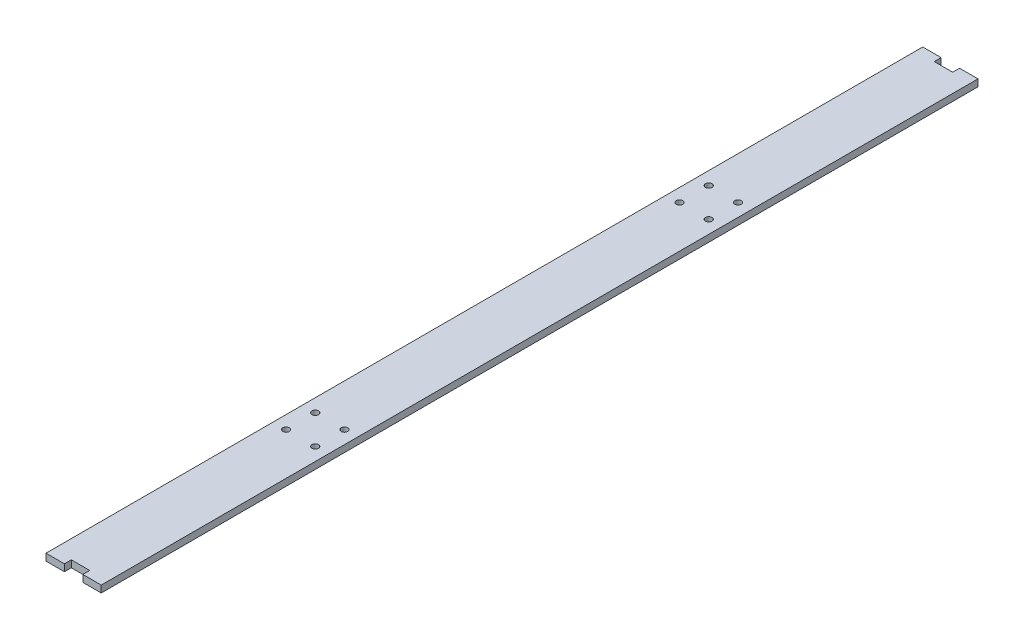
ISO-10303-21;
HEADER;
FILE_DESCRIPTION(('STEP AP214'),'2;1');
FILE_NAME('part.step','',(''),(''),'','','');
FILE_SCHEMA(('AUTOMOTIVE_DESIGN { 1 0 10303 214 1 1 1 1 }'));
ENDSEC;
DATA;
#1=APPLICATION_CONTEXT('core data for automotive mechanical design processes');
#2=APPLICATION_PROTOCOL_DEFINITION('international standard','automotive_design',2000,#1);
#3=PRODUCT_CONTEXT('',#1,'mechanical');
#4=PRODUCT('Part','Part','',(#3));
#5=PRODUCT_RELATED_PRODUCT_CATEGORY('part','',(#4));
#6=PRODUCT_DEFINITION_FORMATION('','',#4);
#7=PRODUCT_DEFINITION_CONTEXT('part definition',#1,'design');
#8=PRODUCT_DEFINITION('design','',#6,#7);
#9=PRODUCT_DEFINITION_SHAPE('','',#8);
#10=(LENGTH_UNIT() NAMED_UNIT(*) SI_UNIT(.MILLI.,.METRE.));
#11=(NAMED_UNIT(*) PLANE_ANGLE_UNIT() SI_UNIT($,.RADIAN.));
#12=(NAMED_UNIT(*) SI_UNIT($,.STERADIAN.) SOLID_ANGLE_UNIT());
#13=UNCERTAINTY_MEASURE_WITH_UNIT(LENGTH_MEASURE(1.E-05),#10,'distance_accuracy_value','');
#14=(GEOMETRIC_REPRESENTATION_CONTEXT(3) GLOBAL_UNCERTAINTY_ASSIGNED_CONTEXT((#13)) GLOBAL_UNIT_ASSIGNED_CONTEXT((#10,
#11,#12)) REPRESENTATION_CONTEXT('',''));
#15=CARTESIAN_POINT('',(0.,0.,0.));
#16=DIRECTION('',(0.,0.,1.));
#17=DIRECTION('',(1.,0.,0.));
#18=AXIS2_PLACEMENT_3D('',#15,#16,#17);
#19=CARTESIAN_POINT('',(-12.7,3.175,201.6125));
#20=DIRECTION('',(0.,0.,-1.));
#21=DIRECTION('',(-1.,0.,0.));
#22=AXIS2_PLACEMENT_3D('',#19,#20,#21);
#23=PLANE('',#22);
#24=DIRECTION('',(0.,1.,0.));
#25=VECTOR('',#24,1.);
#26=CARTESIAN_POINT('',(-4.23333333333333,0.,201.6125));
#27=LINE('',#26,#25);
#28=CARTESIAN_POINT('',(-4.23333333333333,0.,201.6125));
#29=VERTEX_POINT('',#28);
#30=CARTESIAN_POINT('',(-4.23333333333333,3.175,201.6125));
#31=VERTEX_POINT('',#30);
#32=EDGE_CURVE('E122',#29,#31,#27,.T.);
#33=ORIENTED_EDGE('',*,*,#32,.T.);
#34=DIRECTION('',(1.,0.,0.));
#35=VECTOR('',#34,1.);
#36=CARTESIAN_POINT('',(-12.7,3.175,201.6125));
#37=LINE('',#36,#35);
#38=CARTESIAN_POINT('',(-12.7,3.175,201.6125));
#39=VERTEX_POINT('',#38);
#40=EDGE_CURVE('E165',#39,#31,#37,.T.);
#41=ORIENTED_EDGE('',*,*,#40,.F.);
#42=DIRECTION('',(0.,-1.,0.));
#43=VECTOR('',#42,1.);
#44=CARTESIAN_POINT('',(-12.7,3.175,201.6125));
#45=LINE('',#44,#43);
#46=CARTESIAN_POINT('',(-12.7,0.,201.6125));
#47=VERTEX_POINT('',#46);
#48=EDGE_CURVE('E11',#39,#47,#45,.T.);
#49=ORIENTED_EDGE('',*,*,#48,.T.);
#50=DIRECTION('',(1.,0.,0.));
#51=VECTOR('',#50,1.);
#52=CARTESIAN_POINT('',(-12.7,0.,201.6125));
#53=LINE('',#52,#51);
#54=EDGE_CURVE('E142',#47,#29,#53,.T.);
#55=ORIENTED_EDGE('',*,*,#54,.T.);
#56=EDGE_LOOP('',(#33,#41,#49,#55));
#57=FACE_BOUND('',#56,.T.);
#58=ADVANCED_FACE('F33',(#57),#23,.F.);
#59=DIRECTION('',(0.,1.,0.));
#60=VECTOR('',#59,1.);
#61=CARTESIAN_POINT('',(4.23333333333334,0.,201.6125));
#62=LINE('',#61,#60);
#63=CARTESIAN_POINT('',(4.23333333333334,0.,201.6125));
#64=VERTEX_POINT('',#63);
#65=CARTESIAN_POINT('',(4.23333333333334,3.175,201.6125));
#66=VERTEX_POINT('',#65);
#67=EDGE_CURVE('E134',#64,#66,#62,.T.);
#68=ORIENTED_EDGE('',*,*,#67,.F.);
#69=CARTESIAN_POINT('',(12.7,0.,201.6125));
#70=VERTEX_POINT('',#69);
#71=EDGE_CURVE('E149',#64,#70,#53,.T.);
#72=ORIENTED_EDGE('',*,*,#71,.T.);
#73=DIRECTION('',(0.,-1.,0.));
#74=VECTOR('',#73,1.);
#75=CARTESIAN_POINT('',(12.7,3.175,201.6125));
#76=LINE('',#75,#74);
#77=CARTESIAN_POINT('',(12.7,3.175,201.6125));
#78=VERTEX_POINT('',#77);
#79=EDGE_CURVE('E42',#78,#70,#76,.T.);
#80=ORIENTED_EDGE('',*,*,#79,.F.);
#81=EDGE_CURVE('E168',#66,#78,#37,.T.);
#82=ORIENTED_EDGE('',*,*,#81,.F.);
#83=EDGE_LOOP('',(#68,#72,#80,#82));
#84=FACE_BOUND('',#83,.T.);
#85=ADVANCED_FACE('F304',(#84),#23,.F.);
#86=CARTESIAN_POINT('',(0.,3.175,0.));
#87=DIRECTION('',(0.,-1.,0.));
#88=DIRECTION('',(0.,0.,-1.));
#89=AXIS2_PLACEMENT_3D('',#86,#87,#88);
#90=PLANE('',#89);
#91=CARTESIAN_POINT('',(6.7175144212722,3.175,-97.2050144212722));
#92=DIRECTION('',(0.,-1.,0.));
#93=DIRECTION('',(0.,0.,-1.));
#94=AXIS2_PLACEMENT_3D('',#91,#92,#93);
#95=CIRCLE('',#94,1.5);
#96=CARTESIAN_POINT('',(6.7175144212722,3.175,-98.7050144212722));
#97=VERTEX_POINT('',#96);
#98=EDGE_CURVE('E259',#97,#97,#95,.T.);
#99=ORIENTED_EDGE('',*,*,#98,.T.);
#100=EDGE_LOOP('',(#99));
#101=FACE_BOUND('',#100,.T.);
#102=CARTESIAN_POINT('',(-6.7175144212722,3.175,-97.2050144212722));
#103=DIRECTION('',(0.,-1.,0.));
#104=DIRECTION('',(0.,0.,-1.));
#105=AXIS2_PLACEMENT_3D('',#102,#103,#104);
#106=CIRCLE('',#105,1.5);
#107=CARTESIAN_POINT('',(-6.7175144212722,3.175,-98.7050144212722));
#108=VERTEX_POINT('',#107);
#109=EDGE_CURVE('E265',#108,#108,#106,.T.);
#110=ORIENTED_EDGE('',*,*,#109,.T.);
#111=EDGE_LOOP('',(#110));
#112=FACE_BOUND('',#111,.T.);
#113=CARTESIAN_POINT('',(-6.7175144212722,3.175,-83.7699855787278));
#114=DIRECTION('',(0.,-1.,0.));
#115=DIRECTION('',(0.,0.,-1.));
#116=AXIS2_PLACEMENT_3D('',#113,#114,#115);
#117=CIRCLE('',#116,1.5);
#118=CARTESIAN_POINT('',(-6.7175144212722,3.175,-85.2699855787278));
#119=VERTEX_POINT('',#118);
#120=EDGE_CURVE('E271',#119,#119,#117,.T.);
#121=ORIENTED_EDGE('',*,*,#120,.T.);
#122=EDGE_LOOP('',(#121));
#123=FACE_BOUND('',#122,.T.);
#124=CARTESIAN_POINT('',(6.7175144212722,3.175,-83.7699855787278));
#125=DIRECTION('',(0.,-1.,0.));
#126=DIRECTION('',(0.,0.,-1.));
#127=AXIS2_PLACEMENT_3D('',#124,#125,#126);
#128=CIRCLE('',#127,1.5);
#129=CARTESIAN_POINT('',(6.7175144212722,3.175,-85.2699855787278));
#130=VERTEX_POINT('',#129);
#131=EDGE_CURVE('E253',#130,#130,#128,.T.);
#132=ORIENTED_EDGE('',*,*,#131,.T.);
#133=EDGE_LOOP('',(#132));
#134=FACE_BOUND('',#133,.T.);
#135=CARTESIAN_POINT('',(6.7175144212722,3.175,97.2050144212722));
#136=DIRECTION('',(0.,1.,0.));
#137=DIRECTION('',(0.,0.,1.));
#138=AXIS2_PLACEMENT_3D('',#135,#136,#137);
#139=CIRCLE('',#138,1.5);
#140=CARTESIAN_POINT('',(6.7175144212722,3.175,98.7050144212722));
#141=VERTEX_POINT('',#140);
#142=EDGE_CURVE('E235',#141,#141,#139,.T.);
#143=ORIENTED_EDGE('',*,*,#142,.F.);
#144=EDGE_LOOP('',(#143));
#145=FACE_BOUND('',#144,.T.);
#146=CARTESIAN_POINT('',(-6.7175144212722,3.175,97.2050144212722));
#147=DIRECTION('',(0.,1.,0.));
#148=DIRECTION('',(0.,0.,1.));
#149=AXIS2_PLACEMENT_3D('',#146,#147,#148);
#150=CIRCLE('',#149,1.5);
#151=CARTESIAN_POINT('',(-6.7175144212722,3.175,98.7050144212722));
#152=VERTEX_POINT('',#151);
#153=EDGE_CURVE('E242',#152,#152,#150,.T.);
#154=ORIENTED_EDGE('',*,*,#153,.F.);
#155=EDGE_LOOP('',(#154));
#156=FACE_BOUND('',#155,.T.);
#157=CARTESIAN_POINT('',(-6.7175144212722,3.175,83.7699855787278));
#158=DIRECTION('',(0.,1.,0.));
#159=DIRECTION('',(0.,0.,1.));
#160=AXIS2_PLACEMENT_3D('',#157,#158,#159);
#161=CIRCLE('',#160,1.5);
#162=CARTESIAN_POINT('',(-6.7175144212722,3.175,85.2699855787278));
#163=VERTEX_POINT('',#162);
#164=EDGE_CURVE('E248',#163,#163,#161,.T.);
#165=ORIENTED_EDGE('',*,*,#164,.F.);
#166=EDGE_LOOP('',(#165));
#167=FACE_BOUND('',#166,.T.);
#168=CARTESIAN_POINT('',(6.7175144212722,3.175,83.7699855787278));
#169=DIRECTION('',(0.,1.,0.));
#170=DIRECTION('',(0.,0.,1.));
#171=AXIS2_PLACEMENT_3D('',#168,#169,#170);
#172=CIRCLE('',#171,1.5);
#173=CARTESIAN_POINT('',(6.7175144212722,3.175,85.2699855787278));
#174=VERTEX_POINT('',#173);
#175=EDGE_CURVE('E229',#174,#174,#172,.T.);
#176=ORIENTED_EDGE('',*,*,#175,.F.);
#177=EDGE_LOOP('',(#176));
#178=FACE_BOUND('',#177,.T.);
#179=DIRECTION('',(0.,0.,-1.));
#180=VECTOR('',#179,1.);
#181=CARTESIAN_POINT('',(-4.23333333333333,3.175,201.6125));
#182=LINE('',#181,#180);
#183=CARTESIAN_POINT('',(-4.23333333333333,3.175,198.4375));
#184=VERTEX_POINT('',#183);
#185=EDGE_CURVE('E129',#31,#184,#182,.T.);
#186=ORIENTED_EDGE('',*,*,#185,.T.);
#187=DIRECTION('',(1.,0.,0.));
#188=VECTOR('',#187,1.);
#189=CARTESIAN_POINT('',(-4.23333333333333,3.175,198.4375));
#190=LINE('',#189,#188);
#191=CARTESIAN_POINT('',(4.23333333333334,3.175,198.4375));
#192=VERTEX_POINT('',#191);
#193=EDGE_CURVE('E146',#184,#192,#190,.T.);
#194=ORIENTED_EDGE('',*,*,#193,.T.);
#195=DIRECTION('',(0.,0.,1.));
#196=VECTOR('',#195,1.);
#197=CARTESIAN_POINT('',(4.23333333333334,3.175,201.6125));
#198=LINE('',#197,#196);
#199=EDGE_CURVE('E222',#192,#66,#198,.T.);
#200=ORIENTED_EDGE('',*,*,#199,.T.);
#201=ORIENTED_EDGE('',*,*,#81,.T.);
#202=DIRECTION('',(0.,0.,-1.));
#203=VECTOR('',#202,1.);
#204=CARTESIAN_POINT('',(12.7,3.175,201.6125));
#205=LINE('',#204,#203);
#206=CARTESIAN_POINT('',(12.7,3.175,-201.6125));
#207=VERTEX_POINT('',#206);
#208=EDGE_CURVE('E172',#78,#207,#205,.T.);
#209=ORIENTED_EDGE('',*,*,#208,.T.);
#210=DIRECTION('',(1.,0.,0.));
#211=VECTOR('',#210,1.);
#212=CARTESIAN_POINT('',(-12.7,3.175,-201.6125));
#213=LINE('',#212,#211);
#214=CARTESIAN_POINT('',(4.23333333333334,3.175,-201.6125));
#215=VERTEX_POINT('',#214);
#216=EDGE_CURVE('E152',#215,#207,#213,.T.);
#217=ORIENTED_EDGE('',*,*,#216,.F.);
#218=DIRECTION('',(0.,0.,-1.));
#219=VECTOR('',#218,1.);
#220=CARTESIAN_POINT('',(4.23333333333334,3.175,-201.6125));
#221=LINE('',#220,#219);
#222=CARTESIAN_POINT('',(4.23333333333334,3.175,-198.4375));
#223=VERTEX_POINT('',#222);
#224=EDGE_CURVE('E195',#223,#215,#221,.T.);
#225=ORIENTED_EDGE('',*,*,#224,.F.);
#226=DIRECTION('',(1.,0.,0.));
#227=VECTOR('',#226,1.);
#228=CARTESIAN_POINT('',(-4.23333333333333,3.175,-198.4375));
#229=LINE('',#228,#227);
#230=CARTESIAN_POINT('',(-4.23333333333333,3.175,-198.4375));
#231=VERTEX_POINT('',#230);
#232=EDGE_CURVE('E206',#231,#223,#229,.T.);
#233=ORIENTED_EDGE('',*,*,#232,.F.);
#234=DIRECTION('',(0.,0.,1.));
#235=VECTOR('',#234,1.);
#236=CARTESIAN_POINT('',(-4.23333333333333,3.175,-201.6125));
#237=LINE('',#236,#235);
#238=CARTESIAN_POINT('',(-4.23333333333333,3.175,-201.6125));
#239=VERTEX_POINT('',#238);
#240=EDGE_CURVE('E209',#239,#231,#237,.T.);
#241=ORIENTED_EDGE('',*,*,#240,.F.);
#242=CARTESIAN_POINT('',(-12.7,3.175,-201.6125));
#243=VERTEX_POINT('',#242);
#244=EDGE_CURVE('E197',#243,#239,#213,.T.);
#245=ORIENTED_EDGE('',*,*,#244,.F.);
#246=DIRECTION('',(0.,0.,-1.));
#247=VECTOR('',#246,1.);
#248=CARTESIAN_POINT('',(-12.7,3.175,201.6125));
#249=LINE('',#248,#247);
#250=EDGE_CURVE('E148',#39,#243,#249,.T.);
#251=ORIENTED_EDGE('',*,*,#250,.F.);
#252=ORIENTED_EDGE('',*,*,#40,.T.);
#253=EDGE_LOOP('',(#186,#194,#200,#201,#209,#217,#225,#233,#241,#245,#251,#252));
#254=FACE_BOUND('',#253,.T.);
#255=ADVANCED_FACE('F193',(#101,#112,#123,#134,#145,#156,#167,#178,#254),#90,.F.);
#256=CARTESIAN_POINT('',(0.,0.,0.));
#257=DIRECTION('',(0.,-1.,0.));
#258=DIRECTION('',(0.,0.,-1.));
#259=AXIS2_PLACEMENT_3D('',#256,#257,#258);
#260=PLANE('',#259);
#261=CARTESIAN_POINT('',(6.7175144212722,0.,-97.2050144212722));
#262=DIRECTION('',(0.,-1.,0.));
#263=DIRECTION('',(0.,0.,-1.));
#264=AXIS2_PLACEMENT_3D('',#261,#262,#263);
#265=CIRCLE('',#264,1.5);
#266=CARTESIAN_POINT('',(6.7175144212722,0.,-98.7050144212722));
#267=VERTEX_POINT('',#266);
#268=EDGE_CURVE('E262',#267,#267,#265,.T.);
#269=ORIENTED_EDGE('',*,*,#268,.F.);
#270=EDGE_LOOP('',(#269));
#271=FACE_BOUND('',#270,.T.);
#272=CARTESIAN_POINT('',(-6.7175144212722,0.,-97.2050144212722));
#273=DIRECTION('',(0.,-1.,0.));
#274=DIRECTION('',(0.,0.,-1.));
#275=AXIS2_PLACEMENT_3D('',#272,#273,#274);
#276=CIRCLE('',#275,1.5);
#277=CARTESIAN_POINT('',(-6.7175144212722,0.,-98.7050144212722));
#278=VERTEX_POINT('',#277);
#279=EDGE_CURVE('E268',#278,#278,#276,.T.);
#280=ORIENTED_EDGE('',*,*,#279,.F.);
#281=EDGE_LOOP('',(#280));
#282=FACE_BOUND('',#281,.T.);
#283=CARTESIAN_POINT('',(-6.7175144212722,0.,-83.7699855787278));
#284=DIRECTION('',(0.,-1.,0.));
#285=DIRECTION('',(0.,0.,-1.));
#286=AXIS2_PLACEMENT_3D('',#283,#284,#285);
#287=CIRCLE('',#286,1.5);
#288=CARTESIAN_POINT('',(-6.7175144212722,0.,-85.2699855787278));
#289=VERTEX_POINT('',#288);
#290=EDGE_CURVE('E256',#289,#289,#287,.T.);
#291=ORIENTED_EDGE('',*,*,#290,.F.);
#292=EDGE_LOOP('',(#291));
#293=FACE_BOUND('',#292,.T.);
#294=CARTESIAN_POINT('',(6.7175144212722,0.,-83.7699855787278));
#295=DIRECTION('',(0.,-1.,0.));
#296=DIRECTION('',(0.,0.,-1.));
#297=AXIS2_PLACEMENT_3D('',#294,#295,#296);
#298=CIRCLE('',#297,1.5);
#299=CARTESIAN_POINT('',(6.7175144212722,0.,-85.2699855787278));
#300=VERTEX_POINT('',#299);
#301=EDGE_CURVE('E239',#300,#300,#298,.T.);
#302=ORIENTED_EDGE('',*,*,#301,.F.);
#303=EDGE_LOOP('',(#302));
#304=FACE_BOUND('',#303,.T.);
#305=CARTESIAN_POINT('',(6.7175144212722,0.,97.2050144212722));
#306=DIRECTION('',(0.,1.,0.));
#307=DIRECTION('',(0.,0.,1.));
#308=AXIS2_PLACEMENT_3D('',#305,#306,#307);
#309=CIRCLE('',#308,1.5);
#310=CARTESIAN_POINT('',(6.7175144212722,0.,98.7050144212722));
#311=VERTEX_POINT('',#310);
#312=EDGE_CURVE('E238',#311,#311,#309,.T.);
#313=ORIENTED_EDGE('',*,*,#312,.T.);
#314=EDGE_LOOP('',(#313));
#315=FACE_BOUND('',#314,.T.);
#316=CARTESIAN_POINT('',(-6.7175144212722,0.,97.2050144212722));
#317=DIRECTION('',(0.,1.,0.));
#318=DIRECTION('',(0.,0.,1.));
#319=AXIS2_PLACEMENT_3D('',#316,#317,#318);
#320=CIRCLE('',#319,1.5);
#321=CARTESIAN_POINT('',(-6.7175144212722,0.,98.7050144212722));
#322=VERTEX_POINT('',#321);
#323=EDGE_CURVE('E245',#322,#322,#320,.T.);
#324=ORIENTED_EDGE('',*,*,#323,.T.);
#325=EDGE_LOOP('',(#324));
#326=FACE_BOUND('',#325,.T.);
#327=CARTESIAN_POINT('',(-6.7175144212722,0.,83.7699855787278));
#328=DIRECTION('',(0.,1.,0.));
#329=DIRECTION('',(0.,0.,1.));
#330=AXIS2_PLACEMENT_3D('',#327,#328,#329);
#331=CIRCLE('',#330,1.5);
#332=CARTESIAN_POINT('',(-6.7175144212722,0.,85.2699855787278));
#333=VERTEX_POINT('',#332);
#334=EDGE_CURVE('E232',#333,#333,#331,.T.);
#335=ORIENTED_EDGE('',*,*,#334,.T.);
#336=EDGE_LOOP('',(#335));
#337=FACE_BOUND('',#336,.T.);
#338=CARTESIAN_POINT('',(6.7175144212722,0.,83.7699855787278));
#339=DIRECTION('',(0.,1.,0.));
#340=DIRECTION('',(0.,0.,1.));
#341=AXIS2_PLACEMENT_3D('',#338,#339,#340);
#342=CIRCLE('',#341,1.5);
#343=CARTESIAN_POINT('',(6.7175144212722,0.,85.2699855787278));
#344=VERTEX_POINT('',#343);
#345=EDGE_CURVE('E226',#344,#344,#342,.T.);
#346=ORIENTED_EDGE('',*,*,#345,.T.);
#347=EDGE_LOOP('',(#346));
#348=FACE_BOUND('',#347,.T.);
#349=DIRECTION('',(1.,0.,0.));
#350=VECTOR('',#349,1.);
#351=CARTESIAN_POINT('',(-4.23333333333333,0.,198.4375));
#352=LINE('',#351,#350);
#353=CARTESIAN_POINT('',(-4.23333333333333,0.,198.4375));
#354=VERTEX_POINT('',#353);
#355=CARTESIAN_POINT('',(4.23333333333334,0.,198.4375));
#356=VERTEX_POINT('',#355);
#357=EDGE_CURVE('E135',#354,#356,#352,.T.);
#358=ORIENTED_EDGE('',*,*,#357,.F.);
#359=DIRECTION('',(0.,0.,-1.));
#360=VECTOR('',#359,1.);
#361=CARTESIAN_POINT('',(-4.23333333333333,0.,201.6125));
#362=LINE('',#361,#360);
#363=EDGE_CURVE('E126',#29,#354,#362,.T.);
#364=ORIENTED_EDGE('',*,*,#363,.F.);
#365=ORIENTED_EDGE('',*,*,#54,.F.);
#366=DIRECTION('',(0.,0.,-1.));
#367=VECTOR('',#366,1.);
#368=CARTESIAN_POINT('',(-12.7,0.,201.6125));
#369=LINE('',#368,#367);
#370=CARTESIAN_POINT('',(-12.7,0.,-201.6125));
#371=VERTEX_POINT('',#370);
#372=EDGE_CURVE('E176',#47,#371,#369,.T.);
#373=ORIENTED_EDGE('',*,*,#372,.T.);
#374=DIRECTION('',(1.,0.,0.));
#375=VECTOR('',#374,1.);
#376=CARTESIAN_POINT('',(-12.7,0.,-201.6125));
#377=LINE('',#376,#375);
#378=CARTESIAN_POINT('',(-4.23333333333333,0.,-201.6125));
#379=VERTEX_POINT('',#378);
#380=EDGE_CURVE('E179',#371,#379,#377,.T.);
#381=ORIENTED_EDGE('',*,*,#380,.T.);
#382=DIRECTION('',(0.,0.,1.));
#383=VECTOR('',#382,1.);
#384=CARTESIAN_POINT('',(-4.23333333333333,0.,-201.6125));
#385=LINE('',#384,#383);
#386=CARTESIAN_POINT('',(-4.23333333333333,0.,-198.4375));
#387=VERTEX_POINT('',#386);
#388=EDGE_CURVE('E205',#379,#387,#385,.T.);
#389=ORIENTED_EDGE('',*,*,#388,.T.);
#390=DIRECTION('',(1.,0.,0.));
#391=VECTOR('',#390,1.);
#392=CARTESIAN_POINT('',(-4.23333333333333,0.,-198.4375));
#393=LINE('',#392,#391);
#394=CARTESIAN_POINT('',(4.23333333333334,0.,-198.4375));
#395=VERTEX_POINT('',#394);
#396=EDGE_CURVE('E214',#387,#395,#393,.T.);
#397=ORIENTED_EDGE('',*,*,#396,.T.);
#398=DIRECTION('',(0.,0.,-1.));
#399=VECTOR('',#398,1.);
#400=CARTESIAN_POINT('',(4.23333333333334,0.,-201.6125));
#401=LINE('',#400,#399);
#402=CARTESIAN_POINT('',(4.23333333333334,0.,-201.6125));
#403=VERTEX_POINT('',#402);
#404=EDGE_CURVE('E58',#395,#403,#401,.T.);
#405=ORIENTED_EDGE('',*,*,#404,.T.);
#406=CARTESIAN_POINT('',(12.7,0.,-201.6125));
#407=VERTEX_POINT('',#406);
#408=EDGE_CURVE('E177',#403,#407,#377,.T.);
#409=ORIENTED_EDGE('',*,*,#408,.T.);
#410=DIRECTION('',(0.,0.,-1.));
#411=VECTOR('',#410,1.);
#412=CARTESIAN_POINT('',(12.7,0.,201.6125));
#413=LINE('',#412,#411);
#414=EDGE_CURVE('E154',#70,#407,#413,.T.);
#415=ORIENTED_EDGE('',*,*,#414,.F.);
#416=ORIENTED_EDGE('',*,*,#71,.F.);
#417=DIRECTION('',(0.,0.,1.));
#418=VECTOR('',#417,1.);
#419=CARTESIAN_POINT('',(4.23333333333334,0.,201.6125));
#420=LINE('',#419,#418);
#421=EDGE_CURVE('E145',#356,#64,#420,.T.);
#422=ORIENTED_EDGE('',*,*,#421,.F.);
#423=EDGE_LOOP('',(#358,#364,#365,#373,#381,#389,#397,#405,#409,#415,#416,#422));
#424=FACE_BOUND('',#423,.T.);
#425=ADVANCED_FACE('F140',(#271,#282,#293,#304,#315,#326,#337,#348,#424),#260,.T.);
#426=CARTESIAN_POINT('',(-12.7,3.175,-201.6125));
#427=DIRECTION('',(0.,0.,-1.));
#428=DIRECTION('',(-1.,0.,0.));
#429=AXIS2_PLACEMENT_3D('',#426,#427,#428);
#430=PLANE('',#429);
#431=DIRECTION('',(0.,1.,0.));
#432=VECTOR('',#431,1.);
#433=CARTESIAN_POINT('',(-4.23333333333333,0.,-201.6125));
#434=LINE('',#433,#432);
#435=EDGE_CURVE('E178',#379,#239,#434,.T.);
#436=ORIENTED_EDGE('',*,*,#435,.F.);
#437=ORIENTED_EDGE('',*,*,#380,.F.);
#438=DIRECTION('',(0.,-1.,0.));
#439=VECTOR('',#438,1.);
#440=CARTESIAN_POINT('',(-12.7,3.175,-201.6125));
#441=LINE('',#440,#439);
#442=EDGE_CURVE('E37',#243,#371,#441,.T.);
#443=ORIENTED_EDGE('',*,*,#442,.F.);
#444=ORIENTED_EDGE('',*,*,#244,.T.);
#445=EDGE_LOOP('',(#436,#437,#443,#444));
#446=FACE_BOUND('',#445,.T.);
#447=ADVANCED_FACE('F282',(#446),#430,.T.);
#448=CARTESIAN_POINT('',(-12.7,3.175,201.6125));
#449=DIRECTION('',(-1.,0.,0.));
#450=DIRECTION('',(0.,0.,1.));
#451=AXIS2_PLACEMENT_3D('',#448,#449,#450);
#452=PLANE('',#451);
#453=ORIENTED_EDGE('',*,*,#372,.F.);
#454=ORIENTED_EDGE('',*,*,#48,.F.);
#455=ORIENTED_EDGE('',*,*,#250,.T.);
#456=ORIENTED_EDGE('',*,*,#442,.T.);
#457=EDGE_LOOP('',(#453,#454,#455,#456));
#458=FACE_BOUND('',#457,.T.);
#459=ADVANCED_FACE('F35',(#458),#452,.T.);
#460=CARTESIAN_POINT('',(12.7,3.175,201.6125));
#461=DIRECTION('',(-1.,0.,0.));
#462=DIRECTION('',(0.,0.,1.));
#463=AXIS2_PLACEMENT_3D('',#460,#461,#462);
#464=PLANE('',#463);
#465=ORIENTED_EDGE('',*,*,#414,.T.);
#466=DIRECTION('',(0.,-1.,0.));
#467=VECTOR('',#466,1.);
#468=CARTESIAN_POINT('',(12.7,3.175,-201.6125));
#469=LINE('',#468,#467);
#470=EDGE_CURVE('E159',#207,#407,#469,.T.);
#471=ORIENTED_EDGE('',*,*,#470,.F.);
#472=ORIENTED_EDGE('',*,*,#208,.F.);
#473=ORIENTED_EDGE('',*,*,#79,.T.);
#474=EDGE_LOOP('',(#465,#471,#472,#473));
#475=FACE_BOUND('',#474,.T.);
#476=ADVANCED_FACE('F319',(#475),#464,.F.);
#477=DIRECTION('',(0.,1.,0.));
#478=VECTOR('',#477,1.);
#479=CARTESIAN_POINT('',(4.23333333333334,0.,-201.6125));
#480=LINE('',#479,#478);
#481=EDGE_CURVE('E187',#403,#215,#480,.T.);
#482=ORIENTED_EDGE('',*,*,#481,.T.);
#483=ORIENTED_EDGE('',*,*,#216,.T.);
#484=ORIENTED_EDGE('',*,*,#470,.T.);
#485=ORIENTED_EDGE('',*,*,#408,.F.);
#486=EDGE_LOOP('',(#482,#483,#484,#485));
#487=FACE_BOUND('',#486,.T.);
#488=ADVANCED_FACE('F186',(#487),#430,.T.);
#489=CARTESIAN_POINT('',(-4.23333333333333,0.,-201.6125));
#490=DIRECTION('',(-1.,0.,0.));
#491=DIRECTION('',(0.,0.,1.));
#492=AXIS2_PLACEMENT_3D('',#489,#490,#491);
#493=PLANE('',#492);
#494=ORIENTED_EDGE('',*,*,#240,.T.);
#495=DIRECTION('',(0.,1.,0.));
#496=VECTOR('',#495,1.);
#497=CARTESIAN_POINT('',(-4.23333333333333,0.,-198.4375));
#498=LINE('',#497,#496);
#499=EDGE_CURVE('E200',#387,#231,#498,.T.);
#500=ORIENTED_EDGE('',*,*,#499,.F.);
#501=ORIENTED_EDGE('',*,*,#388,.F.);
#502=ORIENTED_EDGE('',*,*,#435,.T.);
#503=EDGE_LOOP('',(#494,#500,#501,#502));
#504=FACE_BOUND('',#503,.T.);
#505=ADVANCED_FACE('F323',(#504),#493,.F.);
#506=CARTESIAN_POINT('',(4.23333333333334,0.,-201.6125));
#507=DIRECTION('',(1.,0.,0.));
#508=DIRECTION('',(0.,0.,-1.));
#509=AXIS2_PLACEMENT_3D('',#506,#507,#508);
#510=PLANE('',#509);
#511=ORIENTED_EDGE('',*,*,#224,.T.);
#512=ORIENTED_EDGE('',*,*,#481,.F.);
#513=ORIENTED_EDGE('',*,*,#404,.F.);
#514=DIRECTION('',(0.,1.,0.));
#515=VECTOR('',#514,1.);
#516=CARTESIAN_POINT('',(4.23333333333334,0.,-198.4375));
#517=LINE('',#516,#515);
#518=EDGE_CURVE('E190',#395,#223,#517,.T.);
#519=ORIENTED_EDGE('',*,*,#518,.T.);
#520=EDGE_LOOP('',(#511,#512,#513,#519));
#521=FACE_BOUND('',#520,.T.);
#522=ADVANCED_FACE('F327',(#521),#510,.F.);
#523=CARTESIAN_POINT('',(-4.23333333333333,0.,-198.4375));
#524=DIRECTION('',(0.,0.,1.));
#525=DIRECTION('',(1.,0.,0.));
#526=AXIS2_PLACEMENT_3D('',#523,#524,#525);
#527=PLANE('',#526);
#528=ORIENTED_EDGE('',*,*,#232,.T.);
#529=ORIENTED_EDGE('',*,*,#518,.F.);
#530=ORIENTED_EDGE('',*,*,#396,.F.);
#531=ORIENTED_EDGE('',*,*,#499,.T.);
#532=EDGE_LOOP('',(#528,#529,#530,#531));
#533=FACE_BOUND('',#532,.T.);
#534=ADVANCED_FACE('F339',(#533),#527,.F.);
#535=CARTESIAN_POINT('',(-4.23333333333333,0.,201.6125));
#536=DIRECTION('',(1.,0.,0.));
#537=DIRECTION('',(0.,0.,-1.));
#538=AXIS2_PLACEMENT_3D('',#535,#536,#537);
#539=PLANE('',#538);
#540=ORIENTED_EDGE('',*,*,#185,.F.);
#541=ORIENTED_EDGE('',*,*,#32,.F.);
#542=ORIENTED_EDGE('',*,*,#363,.T.);
#543=DIRECTION('',(0.,1.,0.));
#544=VECTOR('',#543,1.);
#545=CARTESIAN_POINT('',(-4.23333333333333,0.,198.4375));
#546=LINE('',#545,#544);
#547=EDGE_CURVE('E212',#354,#184,#546,.T.);
#548=ORIENTED_EDGE('',*,*,#547,.T.);
#549=EDGE_LOOP('',(#540,#541,#542,#548));
#550=FACE_BOUND('',#549,.T.);
#551=ADVANCED_FACE('F124',(#550),#539,.T.);
#552=CARTESIAN_POINT('',(-4.23333333333333,0.,198.4375));
#553=DIRECTION('',(0.,0.,1.));
#554=DIRECTION('',(1.,0.,0.));
#555=AXIS2_PLACEMENT_3D('',#552,#553,#554);
#556=PLANE('',#555);
#557=ORIENTED_EDGE('',*,*,#193,.F.);
#558=ORIENTED_EDGE('',*,*,#547,.F.);
#559=ORIENTED_EDGE('',*,*,#357,.T.);
#560=DIRECTION('',(0.,1.,0.));
#561=VECTOR('',#560,1.);
#562=CARTESIAN_POINT('',(4.23333333333334,0.,198.4375));
#563=LINE('',#562,#561);
#564=EDGE_CURVE('E50',#356,#192,#563,.T.);
#565=ORIENTED_EDGE('',*,*,#564,.T.);
#566=EDGE_LOOP('',(#557,#558,#559,#565));
#567=FACE_BOUND('',#566,.T.);
#568=ADVANCED_FACE('F350',(#567),#556,.T.);
#569=CARTESIAN_POINT('',(4.23333333333334,0.,201.6125));
#570=DIRECTION('',(-1.,0.,0.));
#571=DIRECTION('',(0.,0.,1.));
#572=AXIS2_PLACEMENT_3D('',#569,#570,#571);
#573=PLANE('',#572);
#574=ORIENTED_EDGE('',*,*,#199,.F.);
#575=ORIENTED_EDGE('',*,*,#564,.F.);
#576=ORIENTED_EDGE('',*,*,#421,.T.);
#577=ORIENTED_EDGE('',*,*,#67,.T.);
#578=EDGE_LOOP('',(#574,#575,#576,#577));
#579=FACE_BOUND('',#578,.T.);
#580=ADVANCED_FACE('F299',(#579),#573,.T.);
#581=CARTESIAN_POINT('',(6.7175144212722,0.,83.7699855787278));
#582=DIRECTION('',(0.,1.,0.));
#583=DIRECTION('',(0.,0.,1.));
#584=AXIS2_PLACEMENT_3D('',#581,#582,#583);
#585=CYLINDRICAL_SURFACE('',#584,1.5);
#586=ORIENTED_EDGE('',*,*,#345,.F.);
#587=EDGE_LOOP('',(#586));
#588=FACE_BOUND('',#587,.T.);
#589=ORIENTED_EDGE('',*,*,#175,.T.);
#590=EDGE_LOOP('',(#589));
#591=FACE_BOUND('',#590,.T.);
#592=ADVANCED_FACE('F295',(#588,#591),#585,.F.);
#593=CARTESIAN_POINT('',(-6.7175144212722,0.,83.7699855787278));
#594=DIRECTION('',(0.,1.,0.));
#595=DIRECTION('',(0.,0.,1.));
#596=AXIS2_PLACEMENT_3D('',#593,#594,#595);
#597=CYLINDRICAL_SURFACE('',#596,1.5);
#598=ORIENTED_EDGE('',*,*,#334,.F.);
#599=EDGE_LOOP('',(#598));
#600=FACE_BOUND('',#599,.T.);
#601=ORIENTED_EDGE('',*,*,#164,.T.);
#602=EDGE_LOOP('',(#601));
#603=FACE_BOUND('',#602,.T.);
#604=ADVANCED_FACE('F298',(#600,#603),#597,.F.);
#605=CARTESIAN_POINT('',(-6.7175144212722,0.,97.2050144212722));
#606=DIRECTION('',(0.,1.,0.));
#607=DIRECTION('',(0.,0.,1.));
#608=AXIS2_PLACEMENT_3D('',#605,#606,#607);
#609=CYLINDRICAL_SURFACE('',#608,1.5);
#610=ORIENTED_EDGE('',*,*,#323,.F.);
#611=EDGE_LOOP('',(#610));
#612=FACE_BOUND('',#611,.T.);
#613=ORIENTED_EDGE('',*,*,#153,.T.);
#614=EDGE_LOOP('',(#613));
#615=FACE_BOUND('',#614,.T.);
#616=ADVANCED_FACE('F360',(#612,#615),#609,.F.);
#617=CARTESIAN_POINT('',(6.7175144212722,0.,97.2050144212722));
#618=DIRECTION('',(0.,1.,0.));
#619=DIRECTION('',(0.,0.,1.));
#620=AXIS2_PLACEMENT_3D('',#617,#618,#619);
#621=CYLINDRICAL_SURFACE('',#620,1.5);
#622=ORIENTED_EDGE('',*,*,#312,.F.);
#623=EDGE_LOOP('',(#622));
#624=FACE_BOUND('',#623,.T.);
#625=ORIENTED_EDGE('',*,*,#142,.T.);
#626=EDGE_LOOP('',(#625));
#627=FACE_BOUND('',#626,.T.);
#628=ADVANCED_FACE('F356',(#624,#627),#621,.F.);
#629=CARTESIAN_POINT('',(6.7175144212722,0.,-83.7699855787278));
#630=DIRECTION('',(0.,1.,0.));
#631=DIRECTION('',(0.,0.,1.));
#632=AXIS2_PLACEMENT_3D('',#629,#630,#631);
#633=CYLINDRICAL_SURFACE('',#632,1.5);
#634=ORIENTED_EDGE('',*,*,#301,.T.);
#635=EDGE_LOOP('',(#634));
#636=FACE_BOUND('',#635,.T.);
#637=ORIENTED_EDGE('',*,*,#131,.F.);
#638=EDGE_LOOP('',(#637));
#639=FACE_BOUND('',#638,.T.);
#640=ADVANCED_FACE('F359',(#636,#639),#633,.F.);
#641=CARTESIAN_POINT('',(-6.7175144212722,0.,-83.7699855787278));
#642=DIRECTION('',(0.,1.,0.));
#643=DIRECTION('',(0.,0.,1.));
#644=AXIS2_PLACEMENT_3D('',#641,#642,#643);
#645=CYLINDRICAL_SURFACE('',#644,1.5);
#646=ORIENTED_EDGE('',*,*,#290,.T.);
#647=EDGE_LOOP('',(#646));
#648=FACE_BOUND('',#647,.T.);
#649=ORIENTED_EDGE('',*,*,#120,.F.);
#650=EDGE_LOOP('',(#649));
#651=FACE_BOUND('',#650,.T.);
#652=ADVANCED_FACE('F277',(#648,#651),#645,.F.);
#653=CARTESIAN_POINT('',(-6.7175144212722,0.,-97.2050144212722));
#654=DIRECTION('',(0.,1.,0.));
#655=DIRECTION('',(0.,0.,1.));
#656=AXIS2_PLACEMENT_3D('',#653,#654,#655);
#657=CYLINDRICAL_SURFACE('',#656,1.5);
#658=ORIENTED_EDGE('',*,*,#279,.T.);
#659=EDGE_LOOP('',(#658));
#660=FACE_BOUND('',#659,.T.);
#661=ORIENTED_EDGE('',*,*,#109,.F.);
#662=EDGE_LOOP('',(#661));
#663=FACE_BOUND('',#662,.T.);
#664=ADVANCED_FACE('F374',(#660,#663),#657,.F.);
#665=CARTESIAN_POINT('',(6.7175144212722,0.,-97.2050144212722));
#666=DIRECTION('',(0.,1.,0.));
#667=DIRECTION('',(0.,0.,1.));
#668=AXIS2_PLACEMENT_3D('',#665,#666,#667);
#669=CYLINDRICAL_SURFACE('',#668,1.5);
#670=ORIENTED_EDGE('',*,*,#268,.T.);
#671=EDGE_LOOP('',(#670));
#672=FACE_BOUND('',#671,.T.);
#673=ORIENTED_EDGE('',*,*,#98,.F.);
#674=EDGE_LOOP('',(#673));
#675=FACE_BOUND('',#674,.T.);
#676=ADVANCED_FACE('F371',(#672,#675),#669,.F.);
#677=CLOSED_SHELL('',(#58,#85,#255,#425,#447,#459,#476,#488,#505,#522,#534,#551,#568,#580,#592,
#604,#616,#628,#640,#652,#664,#676));
#678=MANIFOLD_SOLID_BREP('B2',#677);
#679=ADVANCED_BREP_SHAPE_REPRESENTATION('',(#18,#678),#14);
#680=SHAPE_DEFINITION_REPRESENTATION(#9,#679);
ENDSEC;
END-ISO-10303-21;
